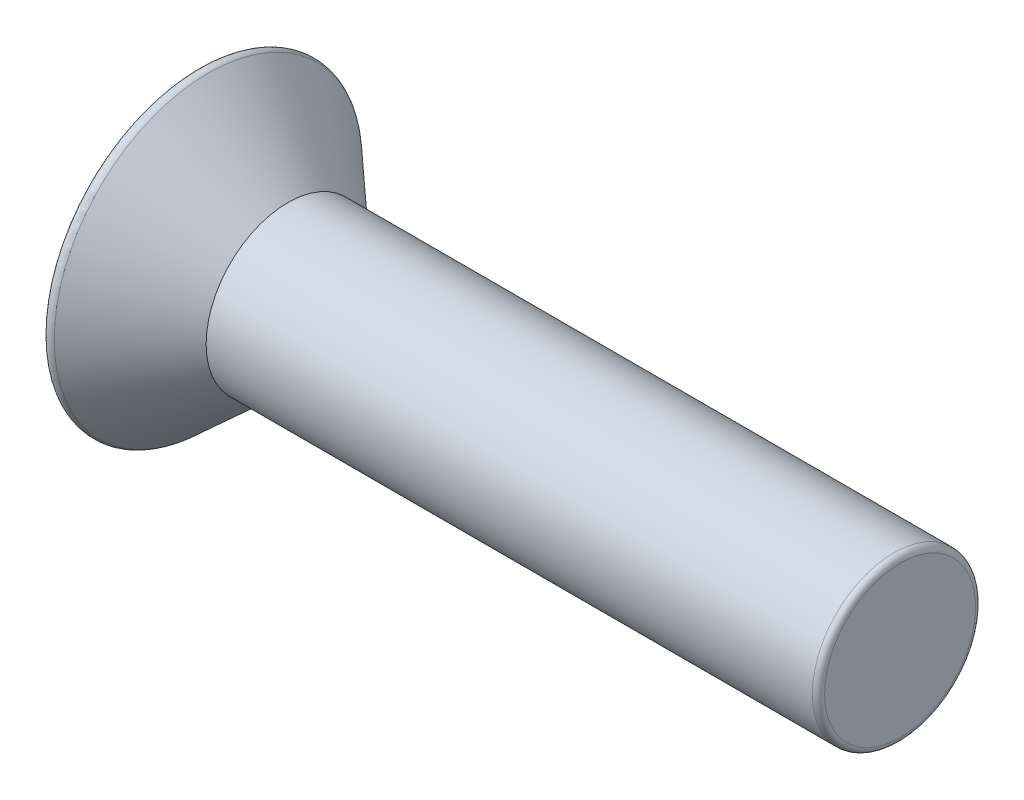
ISO-10303-21;
HEADER;
FILE_DESCRIPTION(('STEP AP214'),'2;1');
FILE_NAME('part.step','',(''),(''),'','','');
FILE_SCHEMA(('AUTOMOTIVE_DESIGN { 1 0 10303 214 1 1 1 1 }'));
ENDSEC;
DATA;
#1=APPLICATION_CONTEXT('core data for automotive mechanical design processes');
#2=APPLICATION_PROTOCOL_DEFINITION('international standard','automotive_design',2000,#1);
#3=PRODUCT_CONTEXT('',#1,'mechanical');
#4=PRODUCT('Part','Part','',(#3));
#5=PRODUCT_RELATED_PRODUCT_CATEGORY('part','',(#4));
#6=PRODUCT_DEFINITION_FORMATION('','',#4);
#7=PRODUCT_DEFINITION_CONTEXT('part definition',#1,'design');
#8=PRODUCT_DEFINITION('design','',#6,#7);
#9=PRODUCT_DEFINITION_SHAPE('','',#8);
#10=(LENGTH_UNIT() NAMED_UNIT(*) SI_UNIT(.MILLI.,.METRE.));
#11=(NAMED_UNIT(*) PLANE_ANGLE_UNIT() SI_UNIT($,.RADIAN.));
#12=(NAMED_UNIT(*) SI_UNIT($,.STERADIAN.) SOLID_ANGLE_UNIT());
#13=UNCERTAINTY_MEASURE_WITH_UNIT(LENGTH_MEASURE(1.E-05),#10,'distance_accuracy_value','');
#14=(GEOMETRIC_REPRESENTATION_CONTEXT(3) GLOBAL_UNCERTAINTY_ASSIGNED_CONTEXT((#13)) GLOBAL_UNIT_ASSIGNED_CONTEXT((#10,
#11,#12)) REPRESENTATION_CONTEXT('',''));
#15=CARTESIAN_POINT('',(0.,0.,0.));
#16=DIRECTION('',(0.,0.,1.));
#17=DIRECTION('',(1.,0.,0.));
#18=AXIS2_PLACEMENT_3D('',#15,#16,#17);
#19=CARTESIAN_POINT('',(0.,0.,0.));
#20=DIRECTION('',(-1.,0.,0.));
#21=DIRECTION('',(0.,0.,1.));
#22=AXIS2_PLACEMENT_3D('',#19,#20,#21);
#23=PLANE('',#22);
#24=CARTESIAN_POINT('',(0.,0.,0.));
#25=DIRECTION('',(-1.,0.,0.));
#26=DIRECTION('',(0.,0.,1.));
#27=AXIS2_PLACEMENT_3D('',#24,#25,#26);
#28=CIRCLE('',#27,3.7);
#29=CARTESIAN_POINT('',(0.,0.,3.7));
#30=VERTEX_POINT('',#29);
#31=EDGE_CURVE('E151',#30,#30,#28,.F.);
#32=ORIENTED_EDGE('',*,*,#31,.T.);
#33=EDGE_LOOP('',(#32));
#34=FACE_BOUND('',#33,.T.);
#35=ADVANCED_FACE('F38',(#34),#23,.F.);
#36=CARTESIAN_POINT('',(-34.4,0.,0.));
#37=DIRECTION('',(-1.,0.,0.));
#38=DIRECTION('',(0.,0.,1.));
#39=AXIS2_PLACEMENT_3D('',#36,#37,#38);
#40=CYLINDRICAL_SURFACE('',#39,4.);
#41=CARTESIAN_POINT('',(-0.300000000000002,0.,0.));
#42=DIRECTION('',(-1.,0.,0.));
#43=DIRECTION('',(0.,0.,1.));
#44=AXIS2_PLACEMENT_3D('',#41,#42,#43);
#45=CIRCLE('',#44,4.);
#46=CARTESIAN_POINT('',(-0.300000000000002,0.,4.));
#47=VERTEX_POINT('',#46);
#48=EDGE_CURVE('E148',#47,#47,#45,.T.);
#49=ORIENTED_EDGE('',*,*,#48,.T.);
#50=EDGE_LOOP('',(#49));
#51=FACE_BOUND('',#50,.T.);
#52=CARTESIAN_POINT('',(-30.,0.,0.));
#53=DIRECTION('',(-1.,0.,0.));
#54=DIRECTION('',(0.,0.,1.));
#55=AXIS2_PLACEMENT_3D('',#52,#53,#54);
#56=CIRCLE('',#55,4.);
#57=CARTESIAN_POINT('',(-30.,0.,4.));
#58=VERTEX_POINT('',#57);
#59=EDGE_CURVE('E140',#58,#58,#56,.T.);
#60=ORIENTED_EDGE('',*,*,#59,.F.);
#61=EDGE_LOOP('',(#60));
#62=FACE_BOUND('',#61,.T.);
#63=ADVANCED_FACE('F168',(#51,#62),#40,.T.);
#64=CARTESIAN_POINT('',(-30.,0.,0.));
#65=DIRECTION('',(-1.,0.,0.));
#66=DIRECTION('',(0.,0.,1.));
#67=AXIS2_PLACEMENT_3D('',#64,#65,#66);
#68=CONICAL_SURFACE('',#67,4.,0.737815060120465);
#69=CARTESIAN_POINT('',(-33.8981981618011,0.,0.));
#70=DIRECTION('',(1.,0.,0.));
#71=DIRECTION('',(0.,0.,-1.));
#72=AXIS2_PLACEMENT_3D('',#69,#70,#71);
#73=CIRCLE('',#72,7.54381651072828);
#74=CARTESIAN_POINT('',(-33.8981981618011,0.,-7.54381651072828));
#75=VERTEX_POINT('',#74);
#76=EDGE_CURVE('E11',#75,#75,#73,.T.);
#77=ORIENTED_EDGE('',*,*,#76,.T.);
#78=EDGE_LOOP('',(#77));
#79=FACE_BOUND('',#78,.T.);
#80=ORIENTED_EDGE('',*,*,#59,.T.);
#81=EDGE_LOOP('',(#80));
#82=FACE_BOUND('',#81,.T.);
#83=ADVANCED_FACE('F174',(#79,#82),#68,.T.);
#84=CARTESIAN_POINT('',(-34.4,8.,0.));
#85=DIRECTION('',(1.,0.,0.));
#86=DIRECTION('',(0.,0.,-1.));
#87=AXIS2_PLACEMENT_3D('',#84,#85,#86);
#88=PLANE('',#87);
#89=CARTESIAN_POINT('',(-34.4,0.,0.));
#90=DIRECTION('',(1.,0.,0.));
#91=DIRECTION('',(0.,0.,-1.));
#92=AXIS2_PLACEMENT_3D('',#89,#90,#91);
#93=CIRCLE('',#92,7.32183448870949);
#94=CARTESIAN_POINT('',(-34.4,0.,-7.32183448870949));
#95=VERTEX_POINT('',#94);
#96=EDGE_CURVE('E46',#95,#95,#93,.F.);
#97=ORIENTED_EDGE('',*,*,#96,.T.);
#98=EDGE_LOOP('',(#97));
#99=FACE_BOUND('',#98,.T.);
#100=DIRECTION('',(0.,0.866025403784438,-0.5));
#101=VECTOR('',#100,1.);
#102=CARTESIAN_POINT('',(-34.4,0.,2.88675134594813));
#103=LINE('',#102,#101);
#104=CARTESIAN_POINT('',(-34.4,0.,2.88675134594813));
#105=VERTEX_POINT('',#104);
#106=CARTESIAN_POINT('',(-34.4,2.5,1.44337567297406));
#107=VERTEX_POINT('',#106);
#108=EDGE_CURVE('E127',#105,#107,#103,.T.);
#109=ORIENTED_EDGE('',*,*,#108,.F.);
#110=DIRECTION('',(0.,0.866025403784439,0.5));
#111=VECTOR('',#110,1.);
#112=CARTESIAN_POINT('',(-34.4,-2.5,1.44337567297406));
#113=LINE('',#112,#111);
#114=CARTESIAN_POINT('',(-34.4,-2.5,1.44337567297406));
#115=VERTEX_POINT('',#114);
#116=EDGE_CURVE('E53',#115,#105,#113,.T.);
#117=ORIENTED_EDGE('',*,*,#116,.F.);
#118=DIRECTION('',(0.,0.,1.));
#119=VECTOR('',#118,1.);
#120=CARTESIAN_POINT('',(-34.4,-2.5,-1.44337567297407));
#121=LINE('',#120,#119);
#122=CARTESIAN_POINT('',(-34.4,-2.5,-1.44337567297407));
#123=VERTEX_POINT('',#122);
#124=EDGE_CURVE('E136',#123,#115,#121,.T.);
#125=ORIENTED_EDGE('',*,*,#124,.F.);
#126=DIRECTION('',(0.,-0.866025403784439,0.5));
#127=VECTOR('',#126,1.);
#128=CARTESIAN_POINT('',(-34.4,0.,-2.88675134594813));
#129=LINE('',#128,#127);
#130=CARTESIAN_POINT('',(-34.4,0.,-2.88675134594813));
#131=VERTEX_POINT('',#130);
#132=EDGE_CURVE('E134',#131,#123,#129,.T.);
#133=ORIENTED_EDGE('',*,*,#132,.F.);
#134=DIRECTION('',(0.,-0.866025403784439,-0.5));
#135=VECTOR('',#134,1.);
#136=CARTESIAN_POINT('',(-34.4,2.5,-1.44337567297407));
#137=LINE('',#136,#135);
#138=CARTESIAN_POINT('',(-34.4,2.5,-1.44337567297407));
#139=VERTEX_POINT('',#138);
#140=EDGE_CURVE('E101',#139,#131,#137,.T.);
#141=ORIENTED_EDGE('',*,*,#140,.F.);
#142=DIRECTION('',(0.,0.,-1.));
#143=VECTOR('',#142,1.);
#144=CARTESIAN_POINT('',(-34.4,2.5,1.44337567297406));
#145=LINE('',#144,#143);
#146=EDGE_CURVE('E130',#107,#139,#145,.T.);
#147=ORIENTED_EDGE('',*,*,#146,.F.);
#148=EDGE_LOOP('',(#109,#117,#125,#133,#141,#147));
#149=FACE_BOUND('',#148,.T.);
#150=ADVANCED_FACE('F156',(#99,#149),#88,.F.);
#151=CARTESIAN_POINT('',(-29.4,-2.5,1.44337567297406));
#152=DIRECTION('',(0.,-0.5,0.866025403784439));
#153=DIRECTION('',(0.,-0.866025403784439,-0.5));
#154=AXIS2_PLACEMENT_3D('',#151,#152,#153);
#155=PLANE('',#154);
#156=ORIENTED_EDGE('',*,*,#116,.T.);
#157=DIRECTION('',(-1.,0.,0.));
#158=VECTOR('',#157,1.);
#159=CARTESIAN_POINT('',(-29.4,0.,2.88675134594813));
#160=LINE('',#159,#158);
#161=CARTESIAN_POINT('',(-29.4,0.,2.88675134594813));
#162=VERTEX_POINT('',#161);
#163=EDGE_CURVE('E83',#162,#105,#160,.T.);
#164=ORIENTED_EDGE('',*,*,#163,.F.);
#165=DIRECTION('',(0.,0.866025403784439,0.5));
#166=VECTOR('',#165,1.);
#167=CARTESIAN_POINT('',(-29.4,-2.5,1.44337567297406));
#168=LINE('',#167,#166);
#169=CARTESIAN_POINT('',(-29.4,-2.5,1.44337567297406));
#170=VERTEX_POINT('',#169);
#171=EDGE_CURVE('E138',#170,#162,#168,.T.);
#172=ORIENTED_EDGE('',*,*,#171,.F.);
#173=DIRECTION('',(-1.,0.,0.));
#174=VECTOR('',#173,1.);
#175=CARTESIAN_POINT('',(-29.4,-2.5,1.44337567297406));
#176=LINE('',#175,#174);
#177=EDGE_CURVE('E61',#170,#115,#176,.T.);
#178=ORIENTED_EDGE('',*,*,#177,.T.);
#179=EDGE_LOOP('',(#156,#164,#172,#178));
#180=FACE_BOUND('',#179,.T.);
#181=ADVANCED_FACE('F183',(#180),#155,.F.);
#182=CARTESIAN_POINT('',(-29.4,-2.5,-1.44337567297407));
#183=DIRECTION('',(0.,-1.,0.));
#184=DIRECTION('',(0.,0.,-1.));
#185=AXIS2_PLACEMENT_3D('',#182,#183,#184);
#186=PLANE('',#185);
#187=ORIENTED_EDGE('',*,*,#124,.T.);
#188=ORIENTED_EDGE('',*,*,#177,.F.);
#189=DIRECTION('',(0.,0.,1.));
#190=VECTOR('',#189,1.);
#191=CARTESIAN_POINT('',(-29.4,-2.5,-1.44337567297407));
#192=LINE('',#191,#190);
#193=CARTESIAN_POINT('',(-29.4,-2.5,-1.44337567297407));
#194=VERTEX_POINT('',#193);
#195=EDGE_CURVE('E113',#194,#170,#192,.T.);
#196=ORIENTED_EDGE('',*,*,#195,.F.);
#197=DIRECTION('',(-1.,0.,0.));
#198=VECTOR('',#197,1.);
#199=CARTESIAN_POINT('',(-29.4,-2.5,-1.44337567297407));
#200=LINE('',#199,#198);
#201=EDGE_CURVE('E105',#194,#123,#200,.T.);
#202=ORIENTED_EDGE('',*,*,#201,.T.);
#203=EDGE_LOOP('',(#187,#188,#196,#202));
#204=FACE_BOUND('',#203,.T.);
#205=ADVANCED_FACE('F186',(#204),#186,.F.);
#206=CARTESIAN_POINT('',(-29.4,0.,-2.88675134594813));
#207=DIRECTION('',(0.,-0.5,-0.866025403784439));
#208=DIRECTION('',(0.,0.866025403784439,-0.5));
#209=AXIS2_PLACEMENT_3D('',#206,#207,#208);
#210=PLANE('',#209);
#211=ORIENTED_EDGE('',*,*,#132,.T.);
#212=ORIENTED_EDGE('',*,*,#201,.F.);
#213=DIRECTION('',(0.,-0.866025403784439,0.5));
#214=VECTOR('',#213,1.);
#215=CARTESIAN_POINT('',(-29.4,0.,-2.88675134594813));
#216=LINE('',#215,#214);
#217=CARTESIAN_POINT('',(-29.4,0.,-2.88675134594813));
#218=VERTEX_POINT('',#217);
#219=EDGE_CURVE('E109',#218,#194,#216,.T.);
#220=ORIENTED_EDGE('',*,*,#219,.F.);
#221=DIRECTION('',(-1.,0.,0.));
#222=VECTOR('',#221,1.);
#223=CARTESIAN_POINT('',(-29.4,0.,-2.88675134594813));
#224=LINE('',#223,#222);
#225=EDGE_CURVE('E94',#218,#131,#224,.T.);
#226=ORIENTED_EDGE('',*,*,#225,.T.);
#227=EDGE_LOOP('',(#211,#212,#220,#226));
#228=FACE_BOUND('',#227,.T.);
#229=ADVANCED_FACE('F110',(#228),#210,.F.);
#230=CARTESIAN_POINT('',(-29.4,2.5,-1.44337567297407));
#231=DIRECTION('',(0.,0.5,-0.866025403784439));
#232=DIRECTION('',(0.,0.866025403784439,0.5));
#233=AXIS2_PLACEMENT_3D('',#230,#231,#232);
#234=PLANE('',#233);
#235=ORIENTED_EDGE('',*,*,#140,.T.);
#236=ORIENTED_EDGE('',*,*,#225,.F.);
#237=DIRECTION('',(0.,-0.866025403784439,-0.5));
#238=VECTOR('',#237,1.);
#239=CARTESIAN_POINT('',(-29.4,2.5,-1.44337567297407));
#240=LINE('',#239,#238);
#241=CARTESIAN_POINT('',(-29.4,2.5,-1.44337567297407));
#242=VERTEX_POINT('',#241);
#243=EDGE_CURVE('E98',#242,#218,#240,.T.);
#244=ORIENTED_EDGE('',*,*,#243,.F.);
#245=DIRECTION('',(-1.,0.,0.));
#246=VECTOR('',#245,1.);
#247=CARTESIAN_POINT('',(-29.4,2.5,-1.44337567297407));
#248=LINE('',#247,#246);
#249=EDGE_CURVE('E106',#242,#139,#248,.T.);
#250=ORIENTED_EDGE('',*,*,#249,.T.);
#251=EDGE_LOOP('',(#235,#236,#244,#250));
#252=FACE_BOUND('',#251,.T.);
#253=ADVANCED_FACE('F96',(#252),#234,.F.);
#254=CARTESIAN_POINT('',(-29.4,2.5,1.44337567297406));
#255=DIRECTION('',(0.,1.,0.));
#256=DIRECTION('',(0.,0.,1.));
#257=AXIS2_PLACEMENT_3D('',#254,#255,#256);
#258=PLANE('',#257);
#259=ORIENTED_EDGE('',*,*,#146,.T.);
#260=ORIENTED_EDGE('',*,*,#249,.F.);
#261=DIRECTION('',(0.,0.,-1.));
#262=VECTOR('',#261,1.);
#263=CARTESIAN_POINT('',(-29.4,2.5,1.44337567297406));
#264=LINE('',#263,#262);
#265=CARTESIAN_POINT('',(-29.4,2.5,1.44337567297406));
#266=VERTEX_POINT('',#265);
#267=EDGE_CURVE('E119',#266,#242,#264,.T.);
#268=ORIENTED_EDGE('',*,*,#267,.F.);
#269=DIRECTION('',(-1.,0.,0.));
#270=VECTOR('',#269,1.);
#271=CARTESIAN_POINT('',(-29.4,2.5,1.44337567297406));
#272=LINE('',#271,#270);
#273=EDGE_CURVE('E143',#266,#107,#272,.T.);
#274=ORIENTED_EDGE('',*,*,#273,.T.);
#275=EDGE_LOOP('',(#259,#260,#268,#274));
#276=FACE_BOUND('',#275,.T.);
#277=ADVANCED_FACE('F190',(#276),#258,.F.);
#278=CARTESIAN_POINT('',(-29.4,0.,2.88675134594813));
#279=DIRECTION('',(0.,0.5,0.866025403784439));
#280=DIRECTION('',(0.,-0.866025403784439,0.5));
#281=AXIS2_PLACEMENT_3D('',#278,#279,#280);
#282=PLANE('',#281);
#283=ORIENTED_EDGE('',*,*,#108,.T.);
#284=ORIENTED_EDGE('',*,*,#273,.F.);
#285=DIRECTION('',(0.,0.866025403784438,-0.5));
#286=VECTOR('',#285,1.);
#287=CARTESIAN_POINT('',(-29.4,0.,2.88675134594813));
#288=LINE('',#287,#286);
#289=EDGE_CURVE('E121',#162,#266,#288,.T.);
#290=ORIENTED_EDGE('',*,*,#289,.F.);
#291=ORIENTED_EDGE('',*,*,#163,.T.);
#292=EDGE_LOOP('',(#283,#284,#290,#291));
#293=FACE_BOUND('',#292,.T.);
#294=ADVANCED_FACE('F187',(#293),#282,.F.);
#295=CARTESIAN_POINT('',(-29.4,0.,0.));
#296=DIRECTION('',(-1.,0.,0.));
#297=DIRECTION('',(0.,0.,1.));
#298=AXIS2_PLACEMENT_3D('',#295,#296,#297);
#299=PLANE('',#298);
#300=ORIENTED_EDGE('',*,*,#171,.T.);
#301=ORIENTED_EDGE('',*,*,#289,.T.);
#302=ORIENTED_EDGE('',*,*,#267,.T.);
#303=ORIENTED_EDGE('',*,*,#243,.T.);
#304=ORIENTED_EDGE('',*,*,#219,.T.);
#305=ORIENTED_EDGE('',*,*,#195,.T.);
#306=EDGE_LOOP('',(#300,#301,#302,#303,#304,#305));
#307=FACE_BOUND('',#306,.T.);
#308=ADVANCED_FACE('F116',(#307),#299,.T.);
#309=CARTESIAN_POINT('',(-0.300000000000002,0.,0.));
#310=DIRECTION('',(-1.,0.,0.));
#311=DIRECTION('',(0.,0.,1.));
#312=AXIS2_PLACEMENT_3D('',#309,#310,#311);
#313=TOROIDAL_SURFACE('',#312,3.7,0.3);
#314=ORIENTED_EDGE('',*,*,#31,.F.);
#315=EDGE_LOOP('',(#314));
#316=FACE_BOUND('',#315,.T.);
#317=ORIENTED_EDGE('',*,*,#48,.F.);
#318=EDGE_LOOP('',(#317));
#319=FACE_BOUND('',#318,.T.);
#320=ADVANCED_FACE('F160',(#316,#319),#313,.T.);
#321=CARTESIAN_POINT('',(-34.1,0.,0.));
#322=DIRECTION('',(1.,0.,0.));
#323=DIRECTION('',(0.,0.,-1.));
#324=AXIS2_PLACEMENT_3D('',#321,#322,#323);
#325=TOROIDAL_SURFACE('',#324,7.32183448870949,0.3);
#326=ORIENTED_EDGE('',*,*,#76,.F.);
#327=EDGE_LOOP('',(#326));
#328=FACE_BOUND('',#327,.T.);
#329=ORIENTED_EDGE('',*,*,#96,.F.);
#330=EDGE_LOOP('',(#329));
#331=FACE_BOUND('',#330,.T.);
#332=ADVANCED_FACE('F40',(#328,#331),#325,.T.);
#333=CLOSED_SHELL('',(#35,#63,#83,#150,#181,#205,#229,#253,#277,#294,#308,#320,#332));
#334=MANIFOLD_SOLID_BREP('B2',#333);
#335=ADVANCED_BREP_SHAPE_REPRESENTATION('',(#18,#334),#14);
#336=SHAPE_DEFINITION_REPRESENTATION(#9,#335);
ENDSEC;
END-ISO-10303-21;
